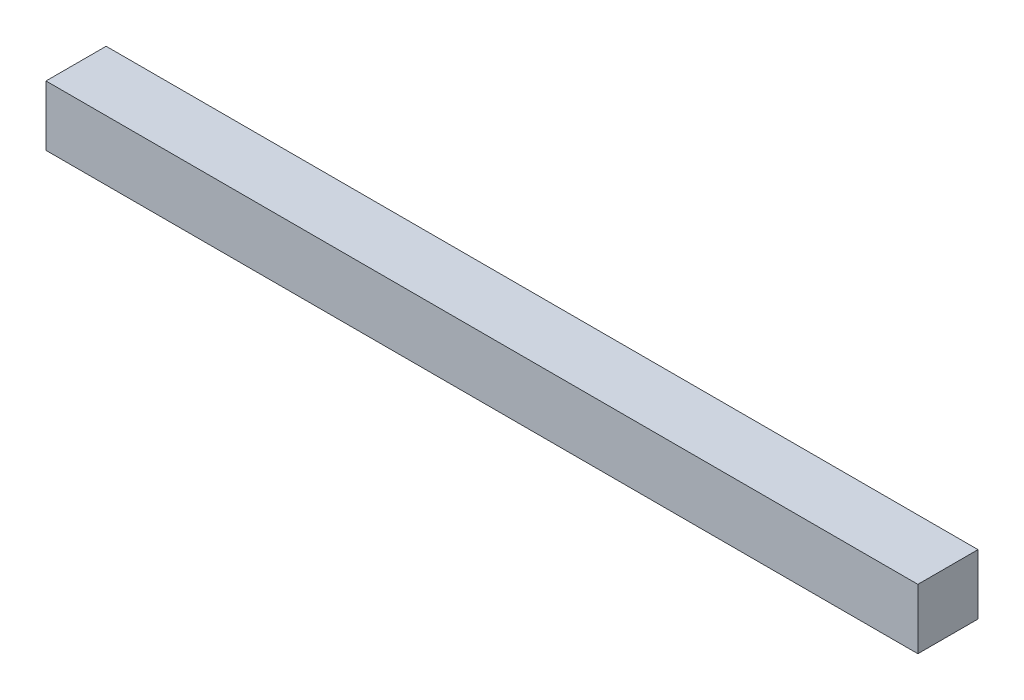
ISO-10303-21;
HEADER;
FILE_DESCRIPTION(('STEP AP214'),'2;1');
FILE_NAME('part.step','',(''),(''),'','','');
FILE_SCHEMA(('AUTOMOTIVE_DESIGN { 1 0 10303 214 1 1 1 1 }'));
ENDSEC;
DATA;
#1=APPLICATION_CONTEXT('core data for automotive mechanical design processes');
#2=APPLICATION_PROTOCOL_DEFINITION('international standard','automotive_design',2000,#1);
#3=PRODUCT_CONTEXT('',#1,'mechanical');
#4=PRODUCT('Part','Part','',(#3));
#5=PRODUCT_RELATED_PRODUCT_CATEGORY('part','',(#4));
#6=PRODUCT_DEFINITION_FORMATION('','',#4);
#7=PRODUCT_DEFINITION_CONTEXT('part definition',#1,'design');
#8=PRODUCT_DEFINITION('design','',#6,#7);
#9=PRODUCT_DEFINITION_SHAPE('','',#8);
#10=(LENGTH_UNIT() NAMED_UNIT(*) SI_UNIT(.MILLI.,.METRE.));
#11=(NAMED_UNIT(*) PLANE_ANGLE_UNIT() SI_UNIT($,.RADIAN.));
#12=(NAMED_UNIT(*) SI_UNIT($,.STERADIAN.) SOLID_ANGLE_UNIT());
#13=UNCERTAINTY_MEASURE_WITH_UNIT(LENGTH_MEASURE(1.E-05),#10,'distance_accuracy_value','');
#14=(GEOMETRIC_REPRESENTATION_CONTEXT(3) GLOBAL_UNCERTAINTY_ASSIGNED_CONTEXT((#13)) GLOBAL_UNIT_ASSIGNED_CONTEXT((#10,
#11,#12)) REPRESENTATION_CONTEXT('',''));
#15=CARTESIAN_POINT('',(0.,0.,0.));
#16=DIRECTION('',(0.,0.,1.));
#17=DIRECTION('',(1.,0.,0.));
#18=AXIS2_PLACEMENT_3D('',#15,#16,#17);
#19=CARTESIAN_POINT('',(-58.,22.,-60.));
#20=DIRECTION('',(-1.,0.,0.));
#21=DIRECTION('',(0.,0.,1.));
#22=AXIS2_PLACEMENT_3D('',#19,#20,#21);
#23=PLANE('',#22);
#24=DIRECTION('',(0.,-1.,0.));
#25=VECTOR('',#24,1.);
#26=CARTESIAN_POINT('',(-58.,22.,-52.));
#27=LINE('',#26,#25);
#28=CARTESIAN_POINT('',(-58.,30.,-52.));
#29=VERTEX_POINT('',#28);
#30=CARTESIAN_POINT('',(-58.,22.,-52.));
#31=VERTEX_POINT('',#30);
#32=EDGE_CURVE('E103',#29,#31,#27,.T.);
#33=ORIENTED_EDGE('',*,*,#32,.F.);
#34=DIRECTION('',(0.,0.,1.));
#35=VECTOR('',#34,1.);
#36=CARTESIAN_POINT('',(-58.,30.,-60.));
#37=LINE('',#36,#35);
#38=CARTESIAN_POINT('',(-58.,30.,-60.));
#39=VERTEX_POINT('',#38);
#40=EDGE_CURVE('E11',#39,#29,#37,.T.);
#41=ORIENTED_EDGE('',*,*,#40,.F.);
#42=DIRECTION('',(0.,-1.,0.));
#43=VECTOR('',#42,1.);
#44=CARTESIAN_POINT('',(-58.,22.,-60.));
#45=LINE('',#44,#43);
#46=CARTESIAN_POINT('',(-58.,22.,-60.));
#47=VERTEX_POINT('',#46);
#48=EDGE_CURVE('E97',#39,#47,#45,.T.);
#49=ORIENTED_EDGE('',*,*,#48,.T.);
#50=DIRECTION('',(0.,0.,1.));
#51=VECTOR('',#50,1.);
#52=CARTESIAN_POINT('',(-58.,22.,-60.));
#53=LINE('',#52,#51);
#54=EDGE_CURVE('E42',#47,#31,#53,.T.);
#55=ORIENTED_EDGE('',*,*,#54,.T.);
#56=EDGE_LOOP('',(#33,#41,#49,#55));
#57=FACE_BOUND('',#56,.T.);
#58=ADVANCED_FACE('F39',(#57),#23,.T.);
#59=CARTESIAN_POINT('',(-58.,30.,-60.));
#60=DIRECTION('',(0.,1.,0.));
#61=DIRECTION('',(0.,0.,1.));
#62=AXIS2_PLACEMENT_3D('',#59,#60,#61);
#63=PLANE('',#62);
#64=DIRECTION('',(-1.,0.,0.));
#65=VECTOR('',#64,1.);
#66=CARTESIAN_POINT('',(-58.,30.,-52.));
#67=LINE('',#66,#65);
#68=CARTESIAN_POINT('',(58.,30.,-52.));
#69=VERTEX_POINT('',#68);
#70=EDGE_CURVE('E99',#69,#29,#67,.T.);
#71=ORIENTED_EDGE('',*,*,#70,.F.);
#72=DIRECTION('',(0.,0.,1.));
#73=VECTOR('',#72,1.);
#74=CARTESIAN_POINT('',(58.,30.,-60.));
#75=LINE('',#74,#73);
#76=CARTESIAN_POINT('',(58.,30.,-60.));
#77=VERTEX_POINT('',#76);
#78=EDGE_CURVE('E48',#77,#69,#75,.T.);
#79=ORIENTED_EDGE('',*,*,#78,.F.);
#80=DIRECTION('',(-1.,0.,0.));
#81=VECTOR('',#80,1.);
#82=CARTESIAN_POINT('',(-58.,30.,-60.));
#83=LINE('',#82,#81);
#84=EDGE_CURVE('E94',#77,#39,#83,.T.);
#85=ORIENTED_EDGE('',*,*,#84,.T.);
#86=ORIENTED_EDGE('',*,*,#40,.T.);
#87=EDGE_LOOP('',(#71,#79,#85,#86));
#88=FACE_BOUND('',#87,.T.);
#89=ADVANCED_FACE('F113',(#88),#63,.T.);
#90=CARTESIAN_POINT('',(58.,22.,-60.));
#91=DIRECTION('',(1.,0.,0.));
#92=DIRECTION('',(0.,0.,-1.));
#93=AXIS2_PLACEMENT_3D('',#90,#91,#92);
#94=PLANE('',#93);
#95=DIRECTION('',(0.,1.,0.));
#96=VECTOR('',#95,1.);
#97=CARTESIAN_POINT('',(58.,22.,-52.));
#98=LINE('',#97,#96);
#99=CARTESIAN_POINT('',(58.,22.,-52.));
#100=VERTEX_POINT('',#99);
#101=EDGE_CURVE('E89',#100,#69,#98,.T.);
#102=ORIENTED_EDGE('',*,*,#101,.F.);
#103=DIRECTION('',(0.,0.,1.));
#104=VECTOR('',#103,1.);
#105=CARTESIAN_POINT('',(58.,22.,-60.));
#106=LINE('',#105,#104);
#107=CARTESIAN_POINT('',(58.,22.,-60.));
#108=VERTEX_POINT('',#107);
#109=EDGE_CURVE('E84',#108,#100,#106,.T.);
#110=ORIENTED_EDGE('',*,*,#109,.F.);
#111=DIRECTION('',(0.,1.,0.));
#112=VECTOR('',#111,1.);
#113=CARTESIAN_POINT('',(58.,22.,-60.));
#114=LINE('',#113,#112);
#115=EDGE_CURVE('E87',#108,#77,#114,.T.);
#116=ORIENTED_EDGE('',*,*,#115,.T.);
#117=ORIENTED_EDGE('',*,*,#78,.T.);
#118=EDGE_LOOP('',(#102,#110,#116,#117));
#119=FACE_BOUND('',#118,.T.);
#120=ADVANCED_FACE('F86',(#119),#94,.T.);
#121=CARTESIAN_POINT('',(-58.,22.,-60.));
#122=DIRECTION('',(0.,-1.,0.));
#123=DIRECTION('',(0.,0.,-1.));
#124=AXIS2_PLACEMENT_3D('',#121,#122,#123);
#125=PLANE('',#124);
#126=DIRECTION('',(1.,0.,0.));
#127=VECTOR('',#126,1.);
#128=CARTESIAN_POINT('',(-58.,22.,-52.));
#129=LINE('',#128,#127);
#130=EDGE_CURVE('E106',#31,#100,#129,.T.);
#131=ORIENTED_EDGE('',*,*,#130,.F.);
#132=ORIENTED_EDGE('',*,*,#54,.F.);
#133=DIRECTION('',(1.,0.,0.));
#134=VECTOR('',#133,1.);
#135=CARTESIAN_POINT('',(-58.,22.,-60.));
#136=LINE('',#135,#134);
#137=EDGE_CURVE('E93',#47,#108,#136,.T.);
#138=ORIENTED_EDGE('',*,*,#137,.T.);
#139=ORIENTED_EDGE('',*,*,#109,.T.);
#140=EDGE_LOOP('',(#131,#132,#138,#139));
#141=FACE_BOUND('',#140,.T.);
#142=ADVANCED_FACE('F96',(#141),#125,.T.);
#143=CARTESIAN_POINT('',(0.,0.,-60.));
#144=DIRECTION('',(0.,0.,-1.));
#145=DIRECTION('',(-1.,0.,0.));
#146=AXIS2_PLACEMENT_3D('',#143,#144,#145);
#147=PLANE('',#146);
#148=ORIENTED_EDGE('',*,*,#48,.F.);
#149=ORIENTED_EDGE('',*,*,#84,.F.);
#150=ORIENTED_EDGE('',*,*,#115,.F.);
#151=ORIENTED_EDGE('',*,*,#137,.F.);
#152=EDGE_LOOP('',(#148,#149,#150,#151));
#153=FACE_BOUND('',#152,.T.);
#154=ADVANCED_FACE('F92',(#153),#147,.T.);
#155=CARTESIAN_POINT('',(0.,0.,-52.));
#156=DIRECTION('',(0.,0.,-1.));
#157=DIRECTION('',(-1.,0.,0.));
#158=AXIS2_PLACEMENT_3D('',#155,#156,#157);
#159=PLANE('',#158);
#160=ORIENTED_EDGE('',*,*,#32,.T.);
#161=ORIENTED_EDGE('',*,*,#130,.T.);
#162=ORIENTED_EDGE('',*,*,#101,.T.);
#163=ORIENTED_EDGE('',*,*,#70,.T.);
#164=EDGE_LOOP('',(#160,#161,#162,#163));
#165=FACE_BOUND('',#164,.T.);
#166=ADVANCED_FACE('F112',(#165),#159,.F.);
#167=CLOSED_SHELL('',(#58,#89,#120,#142,#154,#166));
#168=MANIFOLD_SOLID_BREP('B2',#167);
#169=ADVANCED_BREP_SHAPE_REPRESENTATION('',(#18,#168),#14);
#170=SHAPE_DEFINITION_REPRESENTATION(#9,#169);
ENDSEC;
END-ISO-10303-21;
